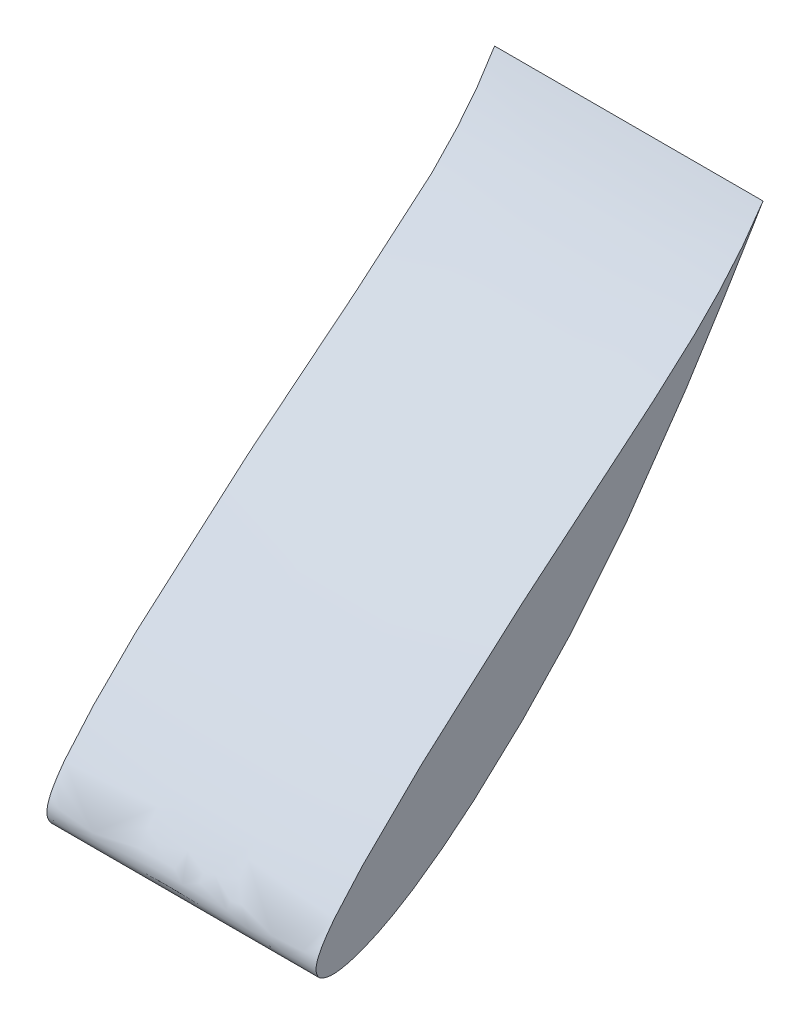
ISO-10303-21;
HEADER;
FILE_DESCRIPTION(('STEP AP214'),'2;1');
FILE_NAME('part.step','',(''),(''),'','','');
FILE_SCHEMA(('AUTOMOTIVE_DESIGN { 1 0 10303 214 1 1 1 1 }'));
ENDSEC;
DATA;
#1=APPLICATION_CONTEXT('core data for automotive mechanical design processes');
#2=APPLICATION_PROTOCOL_DEFINITION('international standard','automotive_design',2000,#1);
#3=PRODUCT_CONTEXT('',#1,'mechanical');
#4=PRODUCT('Part','Part','',(#3));
#5=PRODUCT_RELATED_PRODUCT_CATEGORY('part','',(#4));
#6=PRODUCT_DEFINITION_FORMATION('','',#4);
#7=PRODUCT_DEFINITION_CONTEXT('part definition',#1,'design');
#8=PRODUCT_DEFINITION('design','',#6,#7);
#9=PRODUCT_DEFINITION_SHAPE('','',#8);
#10=(LENGTH_UNIT() NAMED_UNIT(*) SI_UNIT(.MILLI.,.METRE.));
#11=(NAMED_UNIT(*) PLANE_ANGLE_UNIT() SI_UNIT($,.RADIAN.));
#12=(NAMED_UNIT(*) SI_UNIT($,.STERADIAN.) SOLID_ANGLE_UNIT());
#13=UNCERTAINTY_MEASURE_WITH_UNIT(LENGTH_MEASURE(1.E-05),#10,'distance_accuracy_value','');
#14=(GEOMETRIC_REPRESENTATION_CONTEXT(3) GLOBAL_UNCERTAINTY_ASSIGNED_CONTEXT((#13)) GLOBAL_UNIT_ASSIGNED_CONTEXT((#10,
#11,#12)) REPRESENTATION_CONTEXT('',''));
#15=CARTESIAN_POINT('',(0.,0.,0.));
#16=DIRECTION('',(0.,0.,1.));
#17=DIRECTION('',(1.,0.,0.));
#18=AXIS2_PLACEMENT_3D('',#15,#16,#17);
#19=CARTESIAN_POINT('',(457.2,0.,0.));
#20=DIRECTION('',(1.,0.,0.));
#21=DIRECTION('',(0.,0.,-1.));
#22=AXIS2_PLACEMENT_3D('',#19,#20,#21);
#23=PLANE('',#22);
#24=CARTESIAN_POINT('',(457.2,52.9354799084839,-40.4048691135743));
#25=CARTESIAN_POINT('',(457.2,52.4137671791328,-40.1171040912813));
#26=CARTESIAN_POINT('',(457.2,51.8905685831844,-39.8320779606693));
#27=CARTESIAN_POINT('',(457.2,50.8427851251022,-39.2642197298032));
#28=CARTESIAN_POINT('',(457.2,50.3181999086966,-38.9813882816468));
#29=CARTESIAN_POINT('',(457.2,49.2694523012916,-38.4147551131559));
#30=CARTESIAN_POINT('',(457.2,48.7452899840904,-38.1309532558313));
#31=CARTESIAN_POINT('',(457.2,47.6992201579779,-37.5591676312185));
#32=CARTESIAN_POINT('',(457.2,47.1773127322352,-37.2711837113608));
#33=CARTESIAN_POINT('',(457.2,46.1349017641188,-36.6901365499874));
#34=CARTESIAN_POINT('',(457.2,45.6144034418478,-36.397063943887));
#35=CARTESIAN_POINT('',(457.2,44.5761426285644,-35.8061908707365));
#36=CARTESIAN_POINT('',(457.2,44.0583799559348,-35.5083907229367));
#37=CARTESIAN_POINT('',(457.2,43.0257851322636,-34.9078131348833));
#38=CARTESIAN_POINT('',(457.2,42.510952819949,-34.6050359721771));
#39=CARTESIAN_POINT('',(457.2,41.4849956085863,-33.9932456134668));
#40=CARTESIAN_POINT('',(457.2,40.9738707175012,-33.6842324040741));
#41=CARTESIAN_POINT('',(457.2,40.1336696469238,-33.1678314169617));
#42=CARTESIAN_POINT('',(457.2,39.8032749919467,-32.9625890199522));
#43=CARTESIAN_POINT('',(457.2,39.1446917717298,-32.5485956801432));
#44=CARTESIAN_POINT('',(457.2,38.8165032070029,-32.3398447365282));
#45=CARTESIAN_POINT('',(457.2,37.8355279950811,-31.7079754125045));
#46=CARTESIAN_POINT('',(457.2,37.1863386907045,-31.2792447393543));
#47=CARTESIAN_POINT('',(457.2,35.8986992060643,-30.405861784162));
#48=CARTESIAN_POINT('',(457.2,35.2602497323342,-29.961208460602));
#49=CARTESIAN_POINT('',(457.2,33.9951650694657,-29.0549103837809));
#50=CARTESIAN_POINT('',(457.2,33.3685338092642,-28.5932601254226));
#51=CARTESIAN_POINT('',(457.2,32.4392932030813,-27.8867549503951));
#52=CARTESIAN_POINT('',(457.2,32.1313344147112,-27.6489179210354));
#53=CARTESIAN_POINT('',(457.2,31.5192627016711,-27.1683405039597));
#54=CARTESIAN_POINT('',(457.2,31.2151497647286,-26.925600131897));
#55=CARTESIAN_POINT('',(457.2,30.6111562964968,-26.4349992041999));
#56=CARTESIAN_POINT('',(457.2,30.3112751333579,-26.1871394268595));
#57=CARTESIAN_POINT('',(457.2,29.7158628621026,-25.6862547377442));
#58=CARTESIAN_POINT('',(457.2,29.420331739331,-25.4332298433773));
#59=CARTESIAN_POINT('',(457.2,28.6840324472951,-24.7920437085877));
#60=CARTESIAN_POINT('',(457.2,28.246004189344,-24.4007299705181));
#61=CARTESIAN_POINT('',(457.2,27.3795755004373,-23.6074883930266));
#62=CARTESIAN_POINT('',(457.2,26.9511763378778,-23.2055591702679));
#63=CARTESIAN_POINT('',(457.2,26.1038176076999,-22.3916555596177));
#64=CARTESIAN_POINT('',(457.2,25.6848604624223,-21.9796786491964));
#65=CARTESIAN_POINT('',(457.2,24.8570206424311,-21.1454040079464));
#66=CARTESIAN_POINT('',(457.2,24.4481418704601,-20.7231024012673));
#67=CARTESIAN_POINT('',(457.2,23.6421147130416,-19.8690896635006));
#68=CARTESIAN_POINT('',(457.2,23.2449438764881,-19.43739973212));
#69=CARTESIAN_POINT('',(457.2,22.4623198781675,-18.5636361319259));
#70=CARTESIAN_POINT('',(457.2,22.0768648185678,-18.1215641656817));
#71=CARTESIAN_POINT('',(457.2,21.3203157671386,-17.2256213509702));
#72=CARTESIAN_POINT('',(457.2,20.9492145039481,-16.7717566765588));
#73=CARTESIAN_POINT('',(457.2,20.4052688240907,-16.0811189900641));
#74=CARTESIAN_POINT('',(457.2,20.2261029665966,-15.8493096925172));
#75=CARTESIAN_POINT('',(457.2,19.8723136756623,-15.382253605423));
#76=CARTESIAN_POINT('',(457.2,19.6976901325477,-15.1470068990867));
#77=CARTESIAN_POINT('',(457.2,19.3418648654349,-14.6569986272613));
#78=CARTESIAN_POINT('',(457.2,19.1610075414958,-14.4019864838265));
#79=CARTESIAN_POINT('',(457.2,18.805873926172,-13.8874008969019));
#80=CARTESIAN_POINT('',(457.2,18.6315977907803,-13.627827345507));
#81=CARTESIAN_POINT('',(457.2,18.2902390469425,-13.1034038860313));
#82=CARTESIAN_POINT('',(457.2,18.1231681454844,-12.83854634336));
#83=CARTESIAN_POINT('',(457.2,17.7976489134159,-12.3035805580216));
#84=CARTESIAN_POINT('',(457.2,17.6392001124111,-12.0334726028938));
#85=CARTESIAN_POINT('',(457.2,17.3738012548686,-11.5611517336304));
#86=CARTESIAN_POINT('',(457.2,17.2644845001264,-11.3602683645786));
#87=CARTESIAN_POINT('',(457.2,17.0518507431714,-10.9553224036648));
#88=CARTESIAN_POINT('',(457.2,16.9485342237722,-10.7512595576349));
#89=CARTESIAN_POINT('',(457.2,16.7485097381108,-10.3398320265827));
#90=CARTESIAN_POINT('',(457.2,16.6518038877514,-10.1324663103413));
#91=CARTESIAN_POINT('',(457.2,16.4661625519,-9.7152440424853));
#92=CARTESIAN_POINT('',(457.2,16.3771982927722,-9.5054003241108));
#93=CARTESIAN_POINT('',(457.2,16.2073909281223,-9.0824914057902));
#94=CARTESIAN_POINT('',(457.2,16.1265460475586,-8.86942692173089));
#95=CARTESIAN_POINT('',(457.2,15.9749599514939,-8.43980850079228));
#96=CARTESIAN_POINT('',(457.2,15.9042135319009,-8.22325642568962));
#97=CARTESIAN_POINT('',(457.2,15.8034874402061,-7.88325776806801));
#98=CARTESIAN_POINT('',(457.2,15.7693276117838,-7.76104374170039));
#99=CARTESIAN_POINT('',(457.2,15.7052743042024,-7.51550964157994));
#100=CARTESIAN_POINT('',(457.2,15.6753803528027,-7.39218969186383));
#101=CARTESIAN_POINT('',(457.2,15.6202682791386,-7.14379287465528));
#102=CARTESIAN_POINT('',(457.2,15.5950765144787,-7.01871009599406));
#103=CARTESIAN_POINT('',(457.2,15.5613623209077,-6.83035160152533));
#104=CARTESIAN_POINT('',(457.2,15.5508022702041,-6.76743640262986));
#105=CARTESIAN_POINT('',(457.2,15.5311157184808,-6.64137968067121));
#106=CARTESIAN_POINT('',(457.2,15.5219892533447,-6.57823815198328));
#107=CARTESIAN_POINT('',(457.2,15.5050844398142,-6.45080984080302));
#108=CARTESIAN_POINT('',(457.2,15.4973283467258,-6.38652007716671));
#109=CARTESIAN_POINT('',(457.2,15.4835296797135,-6.2577598951192));
#110=CARTESIAN_POINT('',(457.2,15.4774870986419,-6.19328947746269));
#111=CARTESIAN_POINT('',(457.2,15.4625630744186,-5.99955447085834));
#112=CARTESIAN_POINT('',(457.2,15.4568907240827,-5.87000341705987));
#113=CARTESIAN_POINT('',(457.2,15.4575232936983,-5.61190323573918));
#114=CARTESIAN_POINT('',(457.2,15.4637307328678,-5.48335457034874));
#115=CARTESIAN_POINT('',(457.2,15.4915324434705,-5.22796100931924));
#116=CARTESIAN_POINT('',(457.2,15.5130983283915,-5.10111340966897));
#117=CARTESIAN_POINT('',(457.2,15.559829776485,-4.91151294310817));
#118=CARTESIAN_POINT('',(457.2,15.5783515771167,-4.84709518949867));
#119=CARTESIAN_POINT('',(457.2,15.6206103401288,-4.72000381889936));
#120=CARTESIAN_POINT('',(457.2,15.6443451894726,-4.65732950679325));
#121=CARTESIAN_POINT('',(457.2,15.6970921256112,-4.53428250324715));
#122=CARTESIAN_POINT('',(457.2,15.7261013075383,-4.47390856689251));
#123=CARTESIAN_POINT('',(457.2,15.7892667023101,-4.35594521442252));
#124=CARTESIAN_POINT('',(457.2,15.8234201277916,-4.29835431252996));
#125=CARTESIAN_POINT('',(457.2,15.8755215818266,-4.21855545339244));
#126=CARTESIAN_POINT('',(457.2,15.8914983790562,-4.19503976299052));
#127=CARTESIAN_POINT('',(457.2,15.9242717432823,-4.14862809669595));
#128=CARTESIAN_POINT('',(457.2,15.9410673233113,-4.12573142399903));
#129=CARTESIAN_POINT('',(457.2,15.9582662090284,-4.10313794384454));
#130=B_SPLINE_CURVE_WITH_KNOTS('',3,(#24,#25,#26,#27,#28,#29,#30,#31,#32,#33,#34,#35,#36,#37,
#38,#39,#40,#41,#42,#43,#44,#45,#46,#47,#48,#49,#50,#51,#52,#53,#54,#55,#56,#57,#58,#59,#60,#61,
#62,#63,#64,#65,#66,#67,#68,#69,#70,#71,#72,#73,#74,#75,#76,#77,#78,#79,#80,#81,#82,#83,#84,#85,
#86,#87,#88,#89,#90,#91,#92,#93,#94,#95,#96,#97,#98,#99,#100,#101,#102,#103,#104,#105,#106,#107,
#108,#109,#110,#111,#112,#113,#114,#115,#116,#117,#118,#119,#120,#121,#122,#123,#124,#125,#126,
#127,#128,#129),.UNSPECIFIED.,.F.,.F.,(4,2,2,2,2,2,2,2,2,2,2,2,2,2,2,2,2,2,2,2,2,2,2,2,2,2,2,2,
2,2,2,2,2,2,2,2,2,2,2,2,2,2,2,2,2,2,2,2,2,2,2,2,4),(0.,1.78740243978368,3.57531705559406,
5.3634954459217,7.15173923715415,8.94372357062987,10.7355874021623,12.5273516456386,
14.3191197363851,15.4859609607554,16.6528024563576,18.9865095751298,21.3203696240755,
23.6549923486229,24.8222751687598,25.9895542630703,27.1566571855475,28.3237561752133,
30.0856506710399,31.8477759088114,33.6103481872038,35.3735926081428,37.1332009491421,
38.8925227163342,40.6509412493647,41.529828484562,42.4086944792673,43.3465099154056,
44.2843475665187,45.22365563294,46.1629124022081,46.8489276883576,47.5349980989976,
48.2212870845191,48.90490540069,49.5883739388381,50.2714889800971,50.6521213426087,
51.0327115356626,51.4153749112126,51.6067468013617,51.7981234809145,51.9923684624081,
52.1866126336212,52.5752138252862,52.9606399782295,53.3453556032846,53.5462461702077,
53.7470554587213,53.9477544835986,54.1483451500947,54.2336191558206,54.3187927974776),.UNSPECIFIED.);
#131=CARTESIAN_POINT('',(457.2,52.9354799084839,-40.4048691135743));
#132=VERTEX_POINT('',#131);
#133=CARTESIAN_POINT('',(457.2,15.9582662090284,-4.10313794384454));
#134=VERTEX_POINT('',#133);
#135=EDGE_CURVE('E38',#132,#134,#130,.T.);
#136=ORIENTED_EDGE('',*,*,#135,.T.);
#137=CARTESIAN_POINT('',(457.2,15.9582662090284,-4.10313794384454));
#138=CARTESIAN_POINT('',(457.2,15.9897020153264,-4.07603525395711));
#139=CARTESIAN_POINT('',(457.2,16.022089848652,-4.05000458233444));
#140=CARTESIAN_POINT('',(457.2,16.0887589659927,-4.00041472982741));
#141=CARTESIAN_POINT('',(457.2,16.1230423692145,-3.9768584041165));
#142=CARTESIAN_POINT('',(457.2,16.1934066459629,-3.93261662088433));
#143=CARTESIAN_POINT('',(457.2,16.2294868306567,-3.91193007451468));
#144=CARTESIAN_POINT('',(457.2,16.3032888141034,-3.87375793683372));
#145=CARTESIAN_POINT('',(457.2,16.3410099427401,-3.85627105377795));
#146=CARTESIAN_POINT('',(457.2,16.4181180860546,-3.82465223698176));
#147=CARTESIAN_POINT('',(457.2,16.4575141941885,-3.81054242117928));
#148=CARTESIAN_POINT('',(457.2,16.5374440963445,-3.78597966585571));
#149=CARTESIAN_POINT('',(457.2,16.5779782608603,-3.77552793248902));
#150=CARTESIAN_POINT('',(457.2,16.6597137211283,-3.75833661457222));
#151=CARTESIAN_POINT('',(457.2,16.7009130200006,-3.75158749775363));
#152=CARTESIAN_POINT('',(457.2,16.7837553225183,-3.74164969487144));
#153=CARTESIAN_POINT('',(457.2,16.8253985706162,-3.73846308481202));
#154=CARTESIAN_POINT('',(457.2,16.9196325297581,-3.7350510513076));
#155=CARTESIAN_POINT('',(457.2,16.9722589612038,-3.73580902337417));
#156=CARTESIAN_POINT('',(457.2,17.077234931292,-3.74205961557324));
#157=CARTESIAN_POINT('',(457.2,17.1295843040023,-3.74755480728034));
#158=CARTESIAN_POINT('',(457.2,17.2338893525741,-3.76264945874354));
#159=CARTESIAN_POINT('',(457.2,17.2858425742994,-3.77226545563119));
#160=CARTESIAN_POINT('',(457.2,17.3889761189339,-3.79495397219648));
#161=CARTESIAN_POINT('',(457.2,17.4401564231437,-3.8080265753596));
#162=CARTESIAN_POINT('',(457.2,17.6280926365988,-3.86167627107391));
#163=CARTESIAN_POINT('',(457.2,17.7622569331989,-3.91120068965462));
#164=CARTESIAN_POINT('',(457.2,18.0258898005159,-4.02150722358911));
#165=CARTESIAN_POINT('',(457.2,18.1553477224089,-4.08231317332603));
#166=CARTESIAN_POINT('',(457.2,18.4104908166563,-4.21314295466955));
#167=CARTESIAN_POINT('',(457.2,18.5361494670463,-4.28321866374379));
#168=CARTESIAN_POINT('',(457.2,18.7216179623973,-4.39314814950793));
#169=CARTESIAN_POINT('',(457.2,18.7829048965487,-4.43057221251719));
#170=CARTESIAN_POINT('',(457.2,18.9046446755973,-4.50676059389833));
#171=CARTESIAN_POINT('',(457.2,18.965097501129,-4.54552494331469));
#172=CARTESIAN_POINT('',(457.2,19.0915533446006,-4.62815368485821));
#173=CARTESIAN_POINT('',(457.2,19.1574826365934,-4.67213043221843));
#174=CARTESIAN_POINT('',(457.2,19.2885983606809,-4.76117890936007));
#175=CARTESIAN_POINT('',(457.2,19.353784779809,-4.80625065821139));
#176=CARTESIAN_POINT('',(457.2,19.5482524380144,-4.94303182885161));
#177=CARTESIAN_POINT('',(457.2,19.6764375859473,-5.03630422612702));
#178=CARTESIAN_POINT('',(457.2,19.9302829474707,-5.22657897441082));
#179=CARTESIAN_POINT('',(457.2,20.0559393060194,-5.32358644726365));
#180=CARTESIAN_POINT('',(457.2,20.3048060327687,-5.5206764791757));
#181=CARTESIAN_POINT('',(457.2,20.4280164576332,-5.62075896686017));
#182=CARTESIAN_POINT('',(457.2,20.6726718998019,-5.82350094371518));
#183=CARTESIAN_POINT('',(457.2,20.7941132648992,-5.92616482249761));
#184=CARTESIAN_POINT('',(457.2,21.0355349737486,-6.13319472360558));
#185=CARTESIAN_POINT('',(457.2,21.1555152926405,-6.23756077482368));
#186=CARTESIAN_POINT('',(457.2,21.3944207651361,-6.44755720229343));
#187=CARTESIAN_POINT('',(457.2,21.513345624505,-6.55318791294483));
#188=CARTESIAN_POINT('',(457.2,21.7501165953293,-6.76564712416944));
#189=CARTESIAN_POINT('',(457.2,21.8679627238733,-6.87247560570848));
#190=CARTESIAN_POINT('',(457.2,22.2200410424747,-7.19464217324689));
#191=CARTESIAN_POINT('',(457.2,22.4527708435656,-7.411624082476));
#192=CARTESIAN_POINT('',(457.2,22.9144409520659,-7.84894306038991));
#193=CARTESIAN_POINT('',(457.2,23.1433860228656,-8.06927511447871));
#194=CARTESIAN_POINT('',(457.2,23.598141389388,-8.51281311509279));
#195=CARTESIAN_POINT('',(457.2,23.8239538805279,-8.73601681307738));
#196=CARTESIAN_POINT('',(457.2,24.2729612176462,-9.18494952177604));
#197=CARTESIAN_POINT('',(457.2,24.4961565726104,-9.41067802419823));
#198=CARTESIAN_POINT('',(457.2,24.9383265151357,-9.86201631925961));
#199=CARTESIAN_POINT('',(457.2,25.1573210542338,-10.0876065843658));
#200=CARTESIAN_POINT('',(457.2,25.593396569749,-10.5406298049501));
#201=CARTESIAN_POINT('',(457.2,25.81047753781,-10.7680627684664));
#202=CARTESIAN_POINT('',(457.2,26.4589161881648,-11.4530302659166));
#203=CARTESIAN_POINT('',(457.2,26.8874649213002,-11.9132286072324));
#204=CARTESIAN_POINT('',(457.2,27.7377942848645,-12.8403556723915));
#205=CARTESIAN_POINT('',(457.2,28.1595705214955,-13.3072884198676));
#206=CARTESIAN_POINT('',(457.2,28.9966659869544,-14.2468967008062));
#207=CARTESIAN_POINT('',(457.2,29.4119852369521,-14.7195722154315));
#208=CARTESIAN_POINT('',(457.2,30.0309625174289,-15.431320386039));
#209=CARTESIAN_POINT('',(457.2,30.2364419650461,-15.6688150311787));
#210=CARTESIAN_POINT('',(457.2,30.646386774487,-16.144678390807));
#211=CARTESIAN_POINT('',(457.2,30.8508521362456,-16.3830471053516));
#212=CARTESIAN_POINT('',(457.2,31.2589627460274,-16.8604866948287));
#213=CARTESIAN_POINT('',(457.2,31.46260799043,-17.0995575728529));
#214=CARTESIAN_POINT('',(457.2,31.8693010108735,-17.5782068511626));
#215=CARTESIAN_POINT('',(457.2,32.07234878687,-17.8177852514857));
#216=CARTESIAN_POINT('',(457.2,32.4778429404615,-18.2973939205829));
#217=CARTESIAN_POINT('',(457.2,32.6802893970942,-18.5374241225207));
#218=CARTESIAN_POINT('',(457.2,33.0845611164306,-19.0180068167914));
#219=CARTESIAN_POINT('',(457.2,33.2863863793655,-19.2585593089299));
#220=CARTESIAN_POINT('',(457.2,33.8908879340148,-19.9810259659593));
#221=CARTESIAN_POINT('',(457.2,34.2925934504756,-20.4637534004702));
#222=CARTESIAN_POINT('',(457.2,35.0466649777267,-21.3754641189446));
#223=CARTESIAN_POINT('',(457.2,35.399348207576,-21.8041850626722));
#224=CARTESIAN_POINT('',(457.2,36.1024314375798,-22.6635053588918));
#225=CARTESIAN_POINT('',(457.2,36.4528314042357,-23.094104738789));
#226=CARTESIAN_POINT('',(457.2,37.1514521900062,-23.9570055350307));
#227=CARTESIAN_POINT('',(457.2,37.4996731957723,-24.3893068002756));
#228=CARTESIAN_POINT('',(457.2,38.0204454971774,-25.0389392955962));
#229=CARTESIAN_POINT('',(457.2,38.1937598105267,-25.2556593367713));
#230=CARTESIAN_POINT('',(457.2,38.5398849019148,-25.6895011778673));
#231=CARTESIAN_POINT('',(457.2,38.7126956799499,-25.9066229777912));
#232=CARTESIAN_POINT('',(457.2,39.2299570390506,-26.5576280966376));
#233=CARTESIAN_POINT('',(457.2,39.5738677075427,-26.991939965786));
#234=CARTESIAN_POINT('',(457.2,40.2615370428967,-27.8607104619387));
#235=CARTESIAN_POINT('',(457.2,40.6052957035076,-28.2951690938787));
#236=CARTESIAN_POINT('',(457.2,41.121839589148,-28.9462702074219));
#237=CARTESIAN_POINT('',(457.2,41.2942039019865,-29.163246272597));
#238=CARTESIAN_POINT('',(457.2,41.6393460537935,-29.5968699893257));
#239=CARTESIAN_POINT('',(457.2,41.8121238935019,-29.8135176402905));
#240=CARTESIAN_POINT('',(457.2,42.1585338804847,-30.2463932599515));
#241=CARTESIAN_POINT('',(457.2,42.3321665658674,-30.462620798786));
#242=CARTESIAN_POINT('',(457.2,42.6806089210365,-30.8941246088143));
#243=CARTESIAN_POINT('',(457.2,42.8554185868268,-31.1094008832336));
#244=CARTESIAN_POINT('',(457.2,43.3148503209863,-31.6709171206012));
#245=CARTESIAN_POINT('',(457.2,43.6007580307856,-32.0161094894351));
#246=CARTESIAN_POINT('',(457.2,44.1784642731912,-32.7015366365121));
#247=CARTESIAN_POINT('',(457.2,44.4702627076355,-33.0417714972039));
#248=CARTESIAN_POINT('',(457.2,45.0612003142559,-33.7153877683856));
#249=CARTESIAN_POINT('',(457.2,45.3603339625642,-34.0487740084638));
#250=CARTESIAN_POINT('',(457.2,45.9672075562747,-34.7069595453539));
#251=CARTESIAN_POINT('',(457.2,46.2749375647991,-35.0317679758781));
#252=CARTESIAN_POINT('',(457.2,46.9002216530696,-35.6711102804375));
#253=CARTESIAN_POINT('',(457.2,47.2177644098699,-35.9856551945514));
#254=CARTESIAN_POINT('',(457.2,47.8672026079939,-36.6059138507442));
#255=CARTESIAN_POINT('',(457.2,48.1992058656944,-36.9115150879168));
#256=CARTESIAN_POINT('',(457.2,48.8758135788749,-37.5087170241876));
#257=CARTESIAN_POINT('',(457.2,49.2204222933768,-37.8003129128558));
#258=CARTESIAN_POINT('',(457.2,49.9233411173012,-38.3680020383429));
#259=CARTESIAN_POINT('',(457.2,50.2816770487059,-38.6440633770164));
#260=CARTESIAN_POINT('',(457.2,51.0132676702576,-39.1790900724475));
#261=CARTESIAN_POINT('',(457.2,51.3865788373319,-39.437978529325));
#262=CARTESIAN_POINT('',(457.2,52.1494061517508,-39.9368521995779));
#263=CARTESIAN_POINT('',(457.2,52.5390187454854,-40.1766897148497));
#264=CARTESIAN_POINT('',(457.2,52.9354799084839,-40.4048691135743));
#265=B_SPLINE_CURVE_WITH_KNOTS('',3,(#137,#138,#139,#140,#141,#142,#143,#144,#145,#146,#147,
#148,#149,#150,#151,#152,#153,#154,#155,#156,#157,#158,#159,#160,#161,#162,#163,#164,#165,#166,
#167,#168,#169,#170,#171,#172,#173,#174,#175,#176,#177,#178,#179,#180,#181,#182,#183,#184,#185,
#186,#187,#188,#189,#190,#191,#192,#193,#194,#195,#196,#197,#198,#199,#200,#201,#202,#203,#204,
#205,#206,#207,#208,#209,#210,#211,#212,#213,#214,#215,#216,#217,#218,#219,#220,#221,#222,#223,
#224,#225,#226,#227,#228,#229,#230,#231,#232,#233,#234,#235,#236,#237,#238,#239,#240,#241,#242,
#243,#244,#245,#246,#247,#248,#249,#250,#251,#252,#253,#254,#255,#256,#257,#258,#259,#260,#261,
#262,#263,#264),.UNSPECIFIED.,.F.,.F.,(4,2,2,2,2,2,2,2,2,2,2,2,2,2,2,2,2,2,2,2,2,2,2,2,2,2,2,2,
2,2,2,2,2,2,2,2,2,2,2,2,2,2,2,2,2,2,2,2,2,2,2,2,2,2,2,2,2,2,2,2,2,2,2,4),(0.,0.124525638798653,
0.24919342598726,0.373813781735265,0.498383715129927,0.623748459296347,0.749154500263772,
0.874236153909776,0.999390659319536,1.15703307612544,1.31476112220819,1.47312816039159,
1.63149902387587,2.05938490252536,2.48818528376442,2.91949585061344,3.13491594575792,
3.35034103393528,3.58808070570055,3.82582452076969,4.30132826282289,4.77750905712526,
5.25367880704273,5.7307218574973,6.20777301369014,6.68495322656922,7.16212586713364,
8.11664035824057,9.06984456110098,10.022343033479,10.9746530826304,11.9178517316772,
12.8610544973438,14.7474801689798,16.6350839092462,18.5226814595321,19.4648206317325,
20.406959864348,21.3491032516883,22.2912467090843,23.2332603035001,24.1752735473018,
26.0592839678715,27.7247142098297,29.3901688311694,31.0554787798608,31.887973712939,
32.7204686520022,34.3824279664769,36.0444502325879,36.8757696259224,37.7070905078335,
38.5390273087381,39.3709612864979,40.715573182685,42.060162690964,43.4037689818192,
44.7458816486083,46.0864995800645,47.4398733924925,48.7937087731043,50.1502296014225,
51.5124636774795,52.8843958238448),.UNSPECIFIED.);
#266=EDGE_CURVE('E11',#134,#132,#265,.T.);
#267=ORIENTED_EDGE('',*,*,#266,.T.);
#268=EDGE_LOOP('',(#136,#267));
#269=FACE_BOUND('',#268,.T.);
#270=ADVANCED_FACE('F34',(#269),#23,.F.);
#271=CARTESIAN_POINT('',(472.296529068861,-118.449884830258,52.1473222208366));
#272=DIRECTION('',(-0.992432509138968,0.0868265938642406,0.086826593864241));
#273=DIRECTION('',(0.0871557427476515,0.,0.996194698091746));
#274=AXIS2_PLACEMENT_3D('',#271,#272,#273);
#275=PLANE('',#274);
#276=CARTESIAN_POINT('',(479.134440987751,15.9582662090284,-4.10313794384454));
#277=CARTESIAN_POINT('',(479.125834583347,15.9157184529533,-4.15896184025432));
#278=CARTESIAN_POINT('',(479.117278779834,15.8756764895492,-4.21671315849034));
#279=CARTESIAN_POINT('',(479.100346091409,15.8009933525406,-4.33557153581211));
#280=CARTESIAN_POINT('',(479.091969079133,15.7663482155778,-4.39667608730388));
#281=CARTESIAN_POINT('',(479.075619407128,15.7034024976282,-4.520607975498));
#282=CARTESIAN_POINT('',(479.067642051158,15.6749915812691,-4.58337865511644));
#283=CARTESIAN_POINT('',(479.051976446843,15.6237474630873,-4.71119321361102));
#284=CARTESIAN_POINT('',(479.044288248479,15.6009152218229,-4.7762374817618));
#285=CARTESIAN_POINT('',(479.027495316699,15.5560444443775,-4.92331079288327));
#286=CARTESIAN_POINT('',(479.018475527332,15.5354177554752,-5.0057807682045));
#287=CARTESIAN_POINT('',(479.000967552528,15.5018256990572,-5.17230577951144));
#288=CARTESIAN_POINT('',(478.992479495909,15.4888621816708,-5.25636119322107));
#289=CARTESIAN_POINT('',(478.975963530884,15.4696264967111,-5.42590385232585));
#290=CARTESIAN_POINT('',(478.967939594376,15.4634057509095,-5.5113971204854));
#291=CARTESIAN_POINT('',(478.952379637046,15.4567992127399,-5.68264170842998));
#292=CARTESIAN_POINT('',(478.94484369043,15.4564143057276,-5.76839306539599));
#293=CARTESIAN_POINT('',(478.930983717752,15.4602245126824,-5.93062348496922));
#294=CARTESIAN_POINT('',(478.924616319241,15.4639337022134,-6.00711237251844));
#295=CARTESIAN_POINT('',(478.912172056713,15.4744885185482,-6.15990576041205));
#296=CARTESIAN_POINT('',(478.90609525833,15.4813348502276,-6.23621021544138));
#297=CARTESIAN_POINT('',(478.894165658247,15.4974570753671,-6.38868839348404));
#298=CARTESIAN_POINT('',(478.888313200721,15.5067365431003,-6.46486175683556));
#299=CARTESIAN_POINT('',(478.876818285146,15.5274134368291,-6.61692613680618));
#300=CARTESIAN_POINT('',(478.87117580655,15.5388106549485,-6.69281718039235));
#301=CARTESIAN_POINT('',(478.854552329142,15.5760801459156,-6.92009388758571));
#302=CARTESIAN_POINT('',(478.843881227227,15.6050219435825,-7.07100693826773));
#303=CARTESIAN_POINT('',(478.823257788505,15.6702267768445,-7.3719387547842));
#304=CARTESIAN_POINT('',(478.813308691563,15.7065203382005,-7.52195101456247));
#305=CARTESIAN_POINT('',(478.794107454852,15.7853058597975,-7.82020767603878));
#306=CARTESIAN_POINT('',(478.784854593479,15.827791264566,-7.96845377025231));
#307=CARTESIAN_POINT('',(478.771435983889,15.8955463201378,-8.18958423527005));
#308=CARTESIAN_POINT('',(478.767040287042,15.9188001152871,-8.26308107528047));
#309=CARTESIAN_POINT('',(478.758395743378,15.9665822534322,-8.40967079963716));
#310=CARTESIAN_POINT('',(478.754146900951,15.9911106344722,-8.48276367185357));
#311=CARTESIAN_POINT('',(478.741348662321,16.0680578491956,-8.70599542349595));
#312=CARTESIAN_POINT('',(478.73302650483,16.1224198804969,-8.85548015019394));
#313=CARTESIAN_POINT('',(478.716906098049,16.2355086376239,-9.15282599997181));
#314=CARTESIAN_POINT('',(478.709107908008,16.2942358554837,-9.30068693785931));
#315=CARTESIAN_POINT('',(478.693981264598,16.4155533632251,-9.594902770942));
#316=CARTESIAN_POINT('',(478.686652986175,16.4781450750132,-9.74125708840135));
#317=CARTESIAN_POINT('',(478.672452609175,16.606950189895,-10.0323732551102));
#318=CARTESIAN_POINT('',(478.665580491153,16.6731634383861,-10.1771351720226));
#319=CARTESIAN_POINT('',(478.645586187994,16.8770553129029,-10.6095629774092));
#320=CARTESIAN_POINT('',(478.633110665079,17.019785757315,-10.8948893012425));
#321=CARTESIAN_POINT('',(478.609716686176,17.3168834149869,-11.4593813613387));
#322=CARTESIAN_POINT('',(478.598797979416,17.4712487479552,-11.7385480836561));
#323=CARTESIAN_POINT('',(478.578334889096,17.7901741761059,-12.291367704443));
#324=CARTESIAN_POINT('',(478.568791763709,17.9547434100051,-12.565015360646));
#325=CARTESIAN_POINT('',(478.550911814473,18.2924013916283,-13.1070420972005));
#326=CARTESIAN_POINT('',(478.542575045063,18.4654905233483,-13.37542093932));
#327=CARTESIAN_POINT('',(478.5269961498,18.8190265695107,-13.9070245731602));
#328=CARTESIAN_POINT('',(478.51975322081,18.9994679608301,-14.1702530216539));
#329=CARTESIAN_POINT('',(478.506234961773,19.3668477446254,-14.6921472132845));
#330=CARTESIAN_POINT('',(478.49995962969,19.5537861234318,-14.9508129660197));
#331=CARTESIAN_POINT('',(478.485979084101,20.0074966276736,-15.5643218375597));
#332=CARTESIAN_POINT('',(478.478674142081,20.2769048782262,-15.917225957476));
#333=CARTESIAN_POINT('',(478.465581710258,20.8254498342717,-16.6154180940286));
#334=CARTESIAN_POINT('',(478.459794271805,21.1045868686065,-16.9607058525794));
#335=CARTESIAN_POINT('',(478.44958151283,21.6716791142859,-17.6445304674945));
#336=CARTESIAN_POINT('',(478.445157505852,21.9596425373067,-17.9830605216611));
#337=CARTESIAN_POINT('',(478.437524023258,22.5429935756088,-18.6536626652709));
#338=CARTESIAN_POINT('',(478.434314546976,22.8383811868228,-18.9857347582518));
#339=CARTESIAN_POINT('',(478.42897790699,23.4359304542273,-19.6442820998183));
#340=CARTESIAN_POINT('',(478.426851730382,23.7380980275188,-19.9707519829406));
#341=CARTESIAN_POINT('',(478.423665260863,24.348699914168,-20.6177753828511));
#342=CARTESIAN_POINT('',(478.422604957895,24.6571341683699,-20.9383289554329));
#343=CARTESIAN_POINT('',(478.421516942081,25.2799731085027,-21.5736039732332));
#344=CARTESIAN_POINT('',(478.421489261156,25.5943779787079,-21.8883252378517));
#345=CARTESIAN_POINT('',(478.422430307704,26.2288278200935,-22.5120188679784));
#346=CARTESIAN_POINT('',(478.423399043044,26.5488728357889,-22.8209911880733));
#347=CARTESIAN_POINT('',(478.427796345246,27.520576085122,-23.7424330432411));
#348=CARTESIAN_POINT('',(478.432721283331,28.1805928272351,-24.3461574854603));
#349=CARTESIAN_POINT('',(478.443283254344,29.1872680446597,-25.2321088217803));
#350=CARTESIAN_POINT('',(478.447330648261,29.5254564536761,-25.524035306638));
#351=CARTESIAN_POINT('',(478.454215793927,30.0369986147154,-25.9568798925994));
#352=CARTESIAN_POINT('',(478.456646528062,30.2082231904615,-26.1003210500535));
#353=CARTESIAN_POINT('',(478.461783875231,30.5520995844941,-26.3854772972482));
#354=CARTESIAN_POINT('',(478.464490489074,30.7247514069621,-26.5271923819288));
#355=CARTESIAN_POINT('',(478.473009808383,31.244600058622,-26.9496647682981));
#356=CARTESIAN_POINT('',(478.479224210033,31.593854288929,-27.2278880627108));
#357=CARTESIAN_POINT('',(478.492654176693,32.2973705598687,-27.777899112309));
#358=CARTESIAN_POINT('',(478.499869749924,32.6516326416049,-28.0496868146234));
#359=CARTESIAN_POINT('',(478.515232169233,33.3646283719381,-28.5870892887529));
#360=CARTESIAN_POINT('',(478.523378749092,33.7233607162626,-28.852705799195));
#361=CARTESIAN_POINT('',(478.540532985662,34.4449551653434,-29.3782264270712));
#362=CARTESIAN_POINT('',(478.549540640394,34.8078172606125,-29.6381305576242));
#363=CARTESIAN_POINT('',(478.57724038964,35.8811650957884,-30.3948688101503));
#364=CARTESIAN_POINT('',(478.597058903075,36.5969714562639,-30.8841485255019));
#365=CARTESIAN_POINT('',(478.628889844299,37.6802887147623,-31.6036364609638));
#366=CARTESIAN_POINT('',(478.639852483846,38.0430507382381,-31.841094941044));
#367=CARTESIAN_POINT('',(478.662448860957,38.7715724533899,-32.3113388839567));
#368=CARTESIAN_POINT('',(478.674082598076,39.1373321430734,-32.544124349895));
#369=CARTESIAN_POINT('',(478.709921973374,40.2390319078945,-33.2361781805667));
#370=CARTESIAN_POINT('',(478.73505560045,40.9790489500035,-33.6889165506377));
#371=CARTESIAN_POINT('',(478.774187535885,42.0952772545153,-34.3578647864204));
#372=CARTESIAN_POINT('',(478.787473082627,42.4684673879611,-34.5792004257264));
#373=CARTESIAN_POINT('',(478.814446931088,43.2165437564347,-35.018964295494));
#374=CARTESIAN_POINT('',(478.828135232954,43.5914299920911,-35.2373925248778));
#375=CARTESIAN_POINT('',(478.869317963368,44.7070458550792,-35.8822876252663));
#376=CARTESIAN_POINT('',(478.897324973795,45.4499120423459,-36.3050322185053));
#377=CARTESIAN_POINT('',(478.940289427323,46.5679893946653,-36.9320236198458));
#378=CARTESIAN_POINT('',(478.954767345806,46.9412474131226,-37.1397982728055));
#379=CARTESIAN_POINT('',(478.976710727572,47.5020503627743,-37.4497872211659));
#380=CARTESIAN_POINT('',(478.984062937936,47.6891373104065,-37.5528380198002));
#381=CARTESIAN_POINT('',(478.998842810494,48.0636149160175,-37.7583809090449));
#382=CARTESIAN_POINT('',(479.006270472704,48.2510055740594,-37.8608729995393));
#383=CARTESIAN_POINT('',(479.028637495381,48.8132244477958,-38.1674356342212));
#384=CARTESIAN_POINT('',(479.043674363078,49.1884432344757,-38.370782236654));
#385=CARTESIAN_POINT('',(479.073843982441,49.9392624618562,-38.7767611367617));
#386=CARTESIAN_POINT('',(479.088976734308,50.3148629033544,-38.9793934329395));
#387=CARTESIAN_POINT('',(479.119155676009,51.0651983263515,-39.3847819738443));
#388=CARTESIAN_POINT('',(479.134201967642,51.439933711544,-39.5875374587084));
#389=CARTESIAN_POINT('',(479.164074632517,52.1885257863565,-39.9946834115807));
#390=CARTESIAN_POINT('',(479.17890100445,52.5623824707379,-40.1990738893047));
#391=CARTESIAN_POINT('',(479.193538051512,52.9354799084839,-40.4048691135743));
#392=B_SPLINE_CURVE_WITH_KNOTS('',3,(#276,#277,#278,#279,#280,#281,#282,#283,#284,#285,#286,
#287,#288,#289,#290,#291,#292,#293,#294,#295,#296,#297,#298,#299,#300,#301,#302,#303,#304,#305,
#306,#307,#308,#309,#310,#311,#312,#313,#314,#315,#316,#317,#318,#319,#320,#321,#322,#323,#324,
#325,#326,#327,#328,#329,#330,#331,#332,#333,#334,#335,#336,#337,#338,#339,#340,#341,#342,#343,
#344,#345,#346,#347,#348,#349,#350,#351,#352,#353,#354,#355,#356,#357,#358,#359,#360,#361,#362,
#363,#364,#365,#366,#367,#368,#369,#370,#371,#372,#373,#374,#375,#376,#377,#378,#379,#380,#381,
#382,#383,#384,#385,#386,#387,#388,#389,#390,#391),.UNSPECIFIED.,.F.,.F.,(4,2,2,2,2,2,2,2,2,2,2,
2,2,2,2,2,2,2,2,2,2,2,2,2,2,2,2,2,2,2,2,2,2,2,2,2,2,2,2,2,2,2,2,2,2,2,2,2,2,2,2,2,2,2,2,2,2,4),
(0.,0.212089405865886,0.424022314201156,0.631831426577226,0.83967629516916,1.09571899569715,
1.35182348772321,1.60986763448109,1.86795092874889,2.09840387522465,2.32890862693244,
2.55975390550768,2.79057653650864,3.25245209572038,3.71628626945111,4.17963288949153,
4.41126254004697,4.64289910832646,5.12065111390624,5.59845705253862,6.0764398556416,
6.55440226967295,7.5118920572812,8.46922743726459,9.42743296046804,10.385681710091,
11.3432234222488,12.3007631198567,13.6326942516144,14.9646704476352,16.2979259003222,
17.6311806226213,18.9656480360806,20.3001028583967,21.63459893385,22.9691055465489,
25.6518575359824,26.9921121743314,27.6622441128551,28.3323780154257,29.6720007316916,
31.0116344497079,32.3508860565333,33.6901345873686,36.2915531777342,37.5926517919957,
38.8937495414851,41.4971815385119,42.7994530535477,44.101725051354,46.6672047453864,
47.9495063869655,48.5906570533735,49.2318078529352,50.5129311316227,51.7940570938307,
53.0730632548706,54.3520770218922),.UNSPECIFIED.);
#393=CARTESIAN_POINT('',(479.134440987751,15.9582662090284,-4.10313794384454));
#394=VERTEX_POINT('',#393);
#395=CARTESIAN_POINT('',(479.193538051512,52.9354799084839,-40.4048691135743));
#396=VERTEX_POINT('',#395);
#397=EDGE_CURVE('E70',#394,#396,#392,.T.);
#398=ORIENTED_EDGE('',*,*,#397,.T.);
#399=CARTESIAN_POINT('',(479.193538051512,52.9354799084839,-40.4048691135743));
#400=CARTESIAN_POINT('',(479.17723639022,52.4965110166077,-40.1522290628916));
#401=CARTESIAN_POINT('',(479.162919436943,52.0659220439671,-39.8852836150241));
#402=CARTESIAN_POINT('',(479.138009101069,51.2226180065412,-39.326706019521));
#403=CARTESIAN_POINT('',(479.127405631052,50.8098572326219,-39.0351434624776));
#404=CARTESIAN_POINT('',(479.109596932008,50.0012244228212,-38.4300650141981));
#405=CARTESIAN_POINT('',(479.102389155866,49.6053399314141,-38.1165657810753));
#406=CARTESIAN_POINT('',(479.093932754597,49.0260975887365,-37.6339805471986));
#407=CARTESIAN_POINT('',(479.09151483359,48.836644153369,-37.4721640754026));
#408=CARTESIAN_POINT('',(479.087396360379,48.4615574765013,-37.1441517627444));
#409=CARTESIAN_POINT('',(479.085695808992,48.2759242393507,-36.9779559168965));
#410=CARTESIAN_POINT('',(479.081601549677,47.7243251993175,-36.4731544749797));
#411=CARTESIAN_POINT('',(479.08021814121,47.3638649441442,-36.1285066509288));
#412=CARTESIAN_POINT('',(479.079780575051,46.6561999759808,-35.4258430868534));
#413=CARTESIAN_POINT('',(479.080726749172,46.3089971584703,-35.0678254496492));
#414=CARTESIAN_POINT('',(479.084821328924,45.5847303396683,-34.2967573701348));
#415=CARTESIAN_POINT('',(479.088223335355,45.2091636256252,-33.8823055446409));
#416=CARTESIAN_POINT('',(479.096991837155,44.4700798574922,-33.0429973423235));
#417=CARTESIAN_POINT('',(479.102358009672,44.1065608338245,-32.6181426861178));
#418=CARTESIAN_POINT('',(479.114494497242,43.3882597992938,-31.7611209638884));
#419=CARTESIAN_POINT('',(479.121264906278,43.0334783749988,-31.3289534102068));
#420=CARTESIAN_POINT('',(479.135674299862,42.3279749700942,-30.4587498829811));
#421=CARTESIAN_POINT('',(479.143316351803,41.9772724299554,-30.0206982894601));
#422=CARTESIAN_POINT('',(479.158902214418,41.2778215666762,-29.1431002013085));
#423=CARTESIAN_POINT('',(479.166846003708,40.929073107053,-28.7035538146163));
#424=CARTESIAN_POINT('',(479.182840573,40.2322624647425,-27.82392440874));
#425=CARTESIAN_POINT('',(479.190891352256,39.8842002772922,-27.383841393315));
#426=CARTESIAN_POINT('',(479.204872643837,39.2754078049769,-26.6152420269646));
#427=CARTESIAN_POINT('',(479.210825211363,39.0148184776277,-26.2866145414543));
#428=CARTESIAN_POINT('',(479.222580496564,38.4926842784268,-25.6301168175721));
#429=CARTESIAN_POINT('',(479.228383214432,38.2311394078055,-25.302246578226));
#430=CARTESIAN_POINT('',(479.2398014991,37.7068585703323,-24.6474541497943));
#431=CARTESIAN_POINT('',(479.245417065128,37.444122598574,-24.320531964623));
#432=CARTESIAN_POINT('',(479.256458974476,36.9174513885234,-23.6676511532006));
#433=CARTESIAN_POINT('',(479.261885317562,36.6535161487496,-23.3416925281406));
#434=CARTESIAN_POINT('',(479.272533439466,36.1246729611872,-22.691140750295));
#435=CARTESIAN_POINT('',(479.27775543092,35.8597663561067,-22.366546509761));
#436=CARTESIAN_POINT('',(479.287990842089,35.3286414661741,-21.7184303348366));
#437=CARTESIAN_POINT('',(479.293004261971,35.0624231823878,-21.394908399575));
#438=CARTESIAN_POINT('',(479.307734059942,34.2618182850921,-20.425941141068));
#439=CARTESIAN_POINT('',(479.317139914668,33.725484687506,-19.7820981320051));
#440=CARTESIAN_POINT('',(479.33070828098,32.9174341838979,-18.818960491788));
#441=CARTESIAN_POINT('',(479.335142331324,32.6474054481644,-18.4982503287105));
#442=CARTESIAN_POINT('',(479.341665485174,32.2415685456533,-18.0178534365152));
#443=CARTESIAN_POINT('',(479.343818550908,32.1061571876601,-17.8578324245736));
#444=CARTESIAN_POINT('',(479.348084755325,31.8350871469928,-17.5379994442826));
#445=CARTESIAN_POINT('',(479.35019789399,31.699428464206,-17.3781874760285));
#446=CARTESIAN_POINT('',(479.35646776491,31.2920184502495,-16.8991125095277));
#447=CARTESIAN_POINT('',(479.360554899273,31.019836425571,-16.5802143253107));
#448=CARTESIAN_POINT('',(479.368463201234,30.4738342238143,-15.9438198185178));
#449=CARTESIAN_POINT('',(479.372284369218,30.2000140491149,-15.6263234939075));
#450=CARTESIAN_POINT('',(479.379584695793,29.6502149487345,-14.9930812789473));
#451=CARTESIAN_POINT('',(479.383063782107,29.3742355800859,-14.6773357717625));
#452=CARTESIAN_POINT('',(479.389598154657,28.8196999566042,-14.0481119282687));
#453=CARTESIAN_POINT('',(479.392653440506,28.5411436994233,-13.7346335940258));
#454=CARTESIAN_POINT('',(479.401080408922,27.7010443670887,-12.7982135719476));
#455=CARTESIAN_POINT('',(479.405713666364,27.1350372077764,-12.179248037748));
#456=CARTESIAN_POINT('',(479.411017990572,26.2762863859008,-11.2598685127428));
#457=CARTESIAN_POINT('',(479.412511865244,25.9884010151209,-10.9549080763221));
#458=CARTESIAN_POINT('',(479.414922603184,25.4092467487319,-10.3481989491951));
#459=CARTESIAN_POINT('',(479.415839453747,25.1179777787707,-10.0464503293464));
#460=CARTESIAN_POINT('',(479.417057948537,24.5319319622274,-9.44647705361694));
#461=CARTESIAN_POINT('',(479.41735970184,24.2371557469096,-9.14825178227002));
#462=CARTESIAN_POINT('',(479.417158637683,23.6430201602751,-8.55641436946192));
#463=CARTESIAN_POINT('',(479.416655850369,23.3436609610951,-8.26280205557334));
#464=CARTESIAN_POINT('',(479.414633584048,22.7305567936992,-7.67281249799656));
#465=CARTESIAN_POINT('',(479.413084781765,22.4166472104854,-7.37660580588846));
#466=CARTESIAN_POINT('',(479.408670327508,21.7815465083298,-6.79196254677314));
#467=CARTESIAN_POINT('',(479.405804398091,21.4603538688186,-6.50352763039668));
#468=CARTESIAN_POINT('',(479.399626635839,20.912101425382,-6.02588733261882));
#469=CARTESIAN_POINT('',(479.396740813379,20.6873168361217,-5.83408784500715));
#470=CARTESIAN_POINT('',(479.391352285144,20.344734900917,-5.55309706936878));
#471=CARTESIAN_POINT('',(479.389380167536,20.2296726064291,-5.46057618229048));
#472=CARTESIAN_POINT('',(479.385005426612,19.9973912417252,-5.27829833515265));
#473=CARTESIAN_POINT('',(479.382602827997,19.8801722955972,-5.1885412168626));
#474=CARTESIAN_POINT('',(479.37810941866,19.6790053332935,-5.03873415829222));
#475=CARTESIAN_POINT('',(479.376142315752,19.5956589154293,-4.97787182955407));
#476=CARTESIAN_POINT('',(479.371952690858,19.4277460572406,-4.85784660303476));
#477=CARTESIAN_POINT('',(479.369730151786,19.3431795356361,-4.79868381926524));
#478=CARTESIAN_POINT('',(479.366188645774,19.2153159473994,-4.71129982997225));
#479=CARTESIAN_POINT('',(479.364972555428,19.1724938790995,-4.68237773793141));
#480=CARTESIAN_POINT('',(479.362470363654,19.0865307632723,-4.62501480495573));
#481=CARTESIAN_POINT('',(479.361184262016,19.0433897147897,-4.59657396546316));
#482=CARTESIAN_POINT('',(479.357204454648,18.9134292119953,-4.5121028690435));
#483=CARTESIAN_POINT('',(479.354388915484,18.8260602920497,-4.4569157089963));
#484=CARTESIAN_POINT('',(479.34826319012,18.647759224713,-4.3486320029634));
#485=CARTESIAN_POINT('',(479.344944621587,18.5567909158995,-4.29559510605362));
#486=CARTESIAN_POINT('',(479.337740034515,18.3725164727724,-4.19366946998592));
#487=CARTESIAN_POINT('',(479.33385380922,18.279209496959,-4.14478225254813));
#488=CARTESIAN_POINT('',(479.325421896485,18.0902632962597,-4.05221325541882));
#489=CARTESIAN_POINT('',(479.320877288481,17.994628098052,-4.00852316439878));
#490=CARTESIAN_POINT('',(479.311033273116,17.8008398787834,-3.92725255561879));
#491=CARTESIAN_POINT('',(479.305734454049,17.7026888685561,-3.88966732446728));
#492=CARTESIAN_POINT('',(479.297114133384,17.5560300613784,-3.84153923335723));
#493=CARTESIAN_POINT('',(479.294230988832,17.5087505543714,-3.82721421938336));
#494=CARTESIAN_POINT('',(479.288177199421,17.4135077155403,-3.80116651015007));
#495=CARTESIAN_POINT('',(479.285006566974,17.3655444133139,-3.78944370261744));
#496=CARTESIAN_POINT('',(479.275011867133,17.2208083408721,-3.75894757211723));
#497=CARTESIAN_POINT('',(479.267693672608,17.1229907498144,-3.74477732723857));
#498=CARTESIAN_POINT('',(479.252754263341,16.9414345349914,-3.73397934171053));
#499=CARTESIAN_POINT('',(479.245351040594,16.8578336267327,-3.73499765665677));
#500=CARTESIAN_POINT('',(479.229436920806,16.6920898839396,-3.75115313539185));
#501=CARTESIAN_POINT('',(479.2209272268,16.609945574345,-3.76627507337108));
#502=CARTESIAN_POINT('',(479.202963951255,16.4496091428604,-3.81125982089349));
#503=CARTESIAN_POINT('',(479.193507364784,16.371430870579,-3.84117082658253));
#504=CARTESIAN_POINT('',(479.174003287014,16.2215791366035,-3.91425172163212));
#505=CARTESIAN_POINT('',(479.163955293303,16.1499113410635,-3.95743301975041));
#506=CARTESIAN_POINT('',(479.150582392149,16.0606771774341,-4.02105181574751));
#507=CARTESIAN_POINT('',(479.147359294067,16.0396318007867,-4.03684661875819));
#508=CARTESIAN_POINT('',(479.140906484848,15.998360890035,-4.06933165487121));
#509=CARTESIAN_POINT('',(479.137676832805,15.9781328272363,-4.08601868384678));
#510=CARTESIAN_POINT('',(479.134440987752,15.9582662090284,-4.10313794384454));
#511=B_SPLINE_CURVE_WITH_KNOTS('',3,(#399,#400,#401,#402,#403,#404,#405,#406,#407,#408,#409,
#410,#411,#412,#413,#414,#415,#416,#417,#418,#419,#420,#421,#422,#423,#424,#425,#426,#427,#428,
#429,#430,#431,#432,#433,#434,#435,#436,#437,#438,#439,#440,#441,#442,#443,#444,#445,#446,#447,
#448,#449,#450,#451,#452,#453,#454,#455,#456,#457,#458,#459,#460,#461,#462,#463,#464,#465,#466,
#467,#468,#469,#470,#471,#472,#473,#474,#475,#476,#477,#478,#479,#480,#481,#482,#483,#484,#485,
#486,#487,#488,#489,#490,#491,#492,#493,#494,#495,#496,#497,#498,#499,#500,#501,#502,#503,#504,
#505,#506,#507,#508,#509,#510),.UNSPECIFIED.,.F.,.F.,(4,2,2,2,2,2,2,2,2,2,2,2,2,2,2,2,2,2,2,2,2,
2,2,2,2,2,2,2,2,2,2,2,2,2,2,2,2,2,2,2,2,2,2,2,2,2,2,2,2,2,2,2,2,2,2,4),(0.,1.51966600899785,
3.03517133442636,4.54953806068313,5.2969739661569,6.04441072259425,7.54008541662877,
9.03597315979328,10.7136092407779,12.3909696921975,14.0684424420522,15.7520119427482,
17.4354623509972,19.1189010339228,20.3772500727447,21.6355974918146,22.8939500989529,
24.1523042611451,25.4093122045751,26.6663191266495,29.1803475345408,30.4381661241581,
31.0670762587385,31.6959866798331,32.9538227396524,34.2116569733989,35.4697564020474,
36.7278569771171,39.2439042525551,40.5020288831356,41.7601812126139,43.0181104154019,
44.275992485741,45.5706869855564,46.8656543292344,47.7520293091178,48.1949721850558,
48.6378896544203,48.947536551402,49.2572041723413,49.4122664989103,49.5673292901007,
49.8774107897878,50.1933841966376,50.5094729773044,50.8250492670784,51.1403807390247,
51.2887688923431,51.4371506421522,51.733285826891,51.9840752679551,52.2345942779539,
52.4859351404457,52.7374926934956,52.8170068693283,52.8962525152061),.UNSPECIFIED.);
#512=EDGE_CURVE('E61',#396,#394,#511,.T.);
#513=ORIENTED_EDGE('',*,*,#512,.T.);
#514=EDGE_LOOP('',(#398,#513));
#515=FACE_BOUND('',#514,.T.);
#516=ADVANCED_FACE('F72',(#515),#275,.F.);
#517=CARTESIAN_POINT('',(534.287503140715,52.9354799084838,-40.4048691135743));
#518=CARTESIAN_POINT('',(356.191668760477,52.9354799084841,-40.4048691135743));
#519=CARTESIAN_POINT('',(178.095834380238,52.9354799084844,-40.4048691135743));
#520=CARTESIAN_POINT('',(0.,52.9354799084847,-40.4048691135743));
#521=CARTESIAN_POINT('',(534.287503140715,51.3594459522331,-39.5355547738197));
#522=CARTESIAN_POINT('',(356.191668760477,51.3594459522342,-39.5355547738204));
#523=CARTESIAN_POINT('',(178.095834380238,51.3594459522354,-39.535554773821));
#524=CARTESIAN_POINT('',(0.,51.3594459522365,-39.5355547738216));
#525=CARTESIAN_POINT('',(534.287503140715,48.1872661509876,-37.8507210268244));
#526=CARTESIAN_POINT('',(356.191668760477,48.1872661509887,-37.8507210268251));
#527=CARTESIAN_POINT('',(178.095834380238,48.1872661509898,-37.8507210268257));
#528=CARTESIAN_POINT('',(0.,48.187266150991,-37.8507210268263));
#529=CARTESIAN_POINT('',(534.287503140715,43.507704020654,-35.2180308481153));
#530=CARTESIAN_POINT('',(356.191668760477,43.507704020655,-35.2180308481158));
#531=CARTESIAN_POINT('',(178.095834380238,43.507704020656,-35.2180308481164));
#532=CARTESIAN_POINT('',(0.,43.5077040206569,-35.2180308481169));
#533=CARTESIAN_POINT('',(534.287503140715,38.9411088417165,-32.4716733063186));
#534=CARTESIAN_POINT('',(356.191668760477,38.9411088417174,-32.4716733063192));
#535=CARTESIAN_POINT('',(178.095834380238,38.9411088417183,-32.4716733063197));
#536=CARTESIAN_POINT('',(0.,38.9411088417191,-32.4716733063202));
#537=CARTESIAN_POINT('',(534.287503140715,34.5606914175127,-29.5246268627233));
#538=CARTESIAN_POINT('',(356.191668760477,34.5606914175135,-29.5246268627239));
#539=CARTESIAN_POINT('',(178.095834380238,34.5606914175143,-29.5246268627245));
#540=CARTESIAN_POINT('',(0.,34.5606914175151,-29.5246268627251));
#541=CARTESIAN_POINT('',(534.287503140715,30.4010587553919,-26.3479727120398));
#542=CARTESIAN_POINT('',(356.191668760477,30.4010587553925,-26.3479727120402));
#543=CARTESIAN_POINT('',(178.095834380238,30.4010587553932,-26.3479727120406));
#544=CARTESIAN_POINT('',(0.,30.4010587553938,-26.347972712041));
#545=CARTESIAN_POINT('',(534.287503140715,26.5235459159334,-22.8775996756577));
#546=CARTESIAN_POINT('',(356.191668760477,26.523545915934,-22.8775996756581));
#547=CARTESIAN_POINT('',(178.095834380238,26.5235459159346,-22.8775996756586));
#548=CARTESIAN_POINT('',(0.,26.5235459159352,-22.877599675659));
#549=CARTESIAN_POINT('',(534.287503140715,22.8995490309342,-19.1528802757245));
#550=CARTESIAN_POINT('',(356.191668760477,22.8995490309347,-19.1528802757248));
#551=CARTESIAN_POINT('',(178.095834380238,22.8995490309352,-19.1528802757252));
#552=CARTESIAN_POINT('',(0.,22.8995490309356,-19.1528802757255));
#553=CARTESIAN_POINT('',(534.287503140715,20.1174790147798,-15.8072554136178));
#554=CARTESIAN_POINT('',(356.191668760477,20.1174790147802,-15.8072554136181));
#555=CARTESIAN_POINT('',(178.095834380238,20.1174790147806,-15.8072554136184));
#556=CARTESIAN_POINT('',(0.,20.117479014781,-15.8072554136186));
#557=CARTESIAN_POINT('',(534.287503140715,18.1246178310168,-12.9102526792716));
#558=CARTESIAN_POINT('',(356.191668760477,18.1246178310172,-12.9102526792718));
#559=CARTESIAN_POINT('',(178.095834380238,18.1246178310176,-12.910252679272));
#560=CARTESIAN_POINT('',(0.,18.1246178310181,-12.9102526792722));
#561=CARTESIAN_POINT('',(534.287503140715,17.0161487626907,-10.9570930595945));
#562=CARTESIAN_POINT('',(356.191668760477,17.016148762691,-10.9570930595947));
#563=CARTESIAN_POINT('',(178.095834380238,17.0161487626914,-10.9570930595948));
#564=CARTESIAN_POINT('',(0.,17.0161487626917,-10.957093059595));
#565=CARTESIAN_POINT('',(534.287503140715,16.2641848847944,-9.27433077770412));
#566=CARTESIAN_POINT('',(356.191668760477,16.2641848847947,-9.27433077770426));
#567=CARTESIAN_POINT('',(178.095834380238,16.264184884795,-9.2743307777044));
#568=CARTESIAN_POINT('',(0.,16.2641848847953,-9.27433077770454));
#569=CARTESIAN_POINT('',(534.287503140715,15.7751570369478,-7.89467277718706));
#570=CARTESIAN_POINT('',(356.191668760477,15.7751570369481,-7.89467277718718));
#571=CARTESIAN_POINT('',(178.095834380238,15.7751570369484,-7.8946727771873));
#572=CARTESIAN_POINT('',(0.,15.7751570369487,-7.89467277718742));
#573=CARTESIAN_POINT('',(534.287503140715,15.3892980921447,-6.13995615049145));
#574=CARTESIAN_POINT('',(356.191668760477,15.389298092145,-6.13995615049151));
#575=CARTESIAN_POINT('',(178.095834380238,15.3892980921453,-6.13995615049158));
#576=CARTESIAN_POINT('',(0.,15.3892980921456,-6.13995615049165));
#577=CARTESIAN_POINT('',(534.287503140715,15.4313408082035,-4.7953489378336));
#578=CARTESIAN_POINT('',(356.191668760477,15.4313408082038,-4.79534893783365));
#579=CARTESIAN_POINT('',(178.095834380238,15.4313408082041,-4.79534893783369));
#580=CARTESIAN_POINT('',(0.,15.4313408082044,-4.79534893783374));
#581=CARTESIAN_POINT('',(534.287503140715,15.9582662090284,-4.10313794384454));
#582=CARTESIAN_POINT('',(356.191668760477,15.9582662090284,-4.10313794384454));
#583=CARTESIAN_POINT('',(178.095834380238,15.9582662090284,-4.10313794384454));
#584=CARTESIAN_POINT('',(0.,15.9582662090284,-4.10313794384454));
#585=B_SPLINE_SURFACE_WITH_KNOTS('',3,3,((#517,#518,#519,#520),(#521,#522,#523,#524),(#525,#526,
#527,#528),(#529,#530,#531,#532),(#533,#534,#535,#536),(#537,#538,#539,#540),(#541,#542,#543,
#544),(#545,#546,#547,#548),(#549,#550,#551,#552),(#553,#554,#555,#556),(#557,#558,#559,#560),
(#561,#562,#563,#564),(#565,#566,#567,#568),(#569,#570,#571,#572),(#573,#574,#575,#576),(#577,
#578,#579,#580),(#581,#582,#583,#584)),.UNSPECIFIED.,.F.,.F.,.F.,(4,1,1,1,1,1,1,1,1,1,1,1,1,1,
4),(4,4),(0.,0.0994663530511468,0.198488638113877,0.296697313373103,0.39387621036719,
0.490108363418491,0.58570080903983,0.68116964714168,0.777118286663019,0.825716711706629,
0.875356964297213,0.900953601760298,0.927506802585977,0.956099032423321,1.),(0.,1.),.UNSPECIFIED.);
#586=DIRECTION('',(-1.,0.,0.));
#587=VECTOR('',#586,1.);
#588=CARTESIAN_POINT('',(267.143751570358,52.9354799084843,-40.4048691135743));
#589=LINE('',#588,#587);
#590=EDGE_CURVE('E65',#396,#132,#589,.T.);
#591=DIRECTION('',(1.,0.,0.));
#592=VECTOR('',#591,1.);
#593=CARTESIAN_POINT('',(267.143751570358,15.9582662090284,-4.10313794384454));
#594=LINE('',#593,#592);
#595=EDGE_CURVE('E67',#134,#394,#594,.T.);
#596=ORIENTED_EDGE('',*,*,#135,.F.);
#597=ORIENTED_EDGE('',*,*,#590,.F.);
#598=ORIENTED_EDGE('',*,*,#397,.F.);
#599=ORIENTED_EDGE('',*,*,#595,.F.);
#600=EDGE_LOOP('',(#596,#597,#598,#599));
#601=FACE_BOUND('',#600,.T.);
#602=ADVANCED_FACE('F75',(#601),#585,.T.);
#603=CARTESIAN_POINT('',(534.287503140715,15.9582662090284,-4.10313794384454));
#604=CARTESIAN_POINT('',(356.191668760477,15.9582662090284,-4.10313794384454));
#605=CARTESIAN_POINT('',(178.095834380238,15.9582662090284,-4.10313794384453));
#606=CARTESIAN_POINT('',(0.,15.9582662090284,-4.10313794384453));
#607=CARTESIAN_POINT('',(534.287503140715,16.5865780456667,-3.56161913823217));
#608=CARTESIAN_POINT('',(356.191668760477,16.5865780456671,-3.56161913823221));
#609=CARTESIAN_POINT('',(178.095834380238,16.5865780456675,-3.56161913823225));
#610=CARTESIAN_POINT('',(0.,16.5865780456679,-3.56161913823229));
#611=CARTESIAN_POINT('',(534.287503140715,17.7474253796139,-3.80525109933959));
#612=CARTESIAN_POINT('',(356.191668760477,17.7474253796143,-3.80525109933964));
#613=CARTESIAN_POINT('',(178.095834380238,17.7474253796147,-3.80525109933968));
#614=CARTESIAN_POINT('',(0.,17.7474253796151,-3.80525109933972));
#615=CARTESIAN_POINT('',(534.287503140715,19.0939630185473,-4.60399654851653));
#616=CARTESIAN_POINT('',(356.191668760477,19.0939630185478,-4.60399654851659));
#617=CARTESIAN_POINT('',(178.095834380238,19.0939630185483,-4.60399654851664));
#618=CARTESIAN_POINT('',(0.,19.0939630185488,-4.6039965485167));
#619=CARTESIAN_POINT('',(534.287503140715,20.1589429327618,-5.38609073865022));
#620=CARTESIAN_POINT('',(356.191668760477,20.1589429327623,-5.38609073865028));
#621=CARTESIAN_POINT('',(178.095834380238,20.1589429327628,-5.38609073865034));
#622=CARTESIAN_POINT('',(0.,20.1589429327633,-5.38609073865041));
#623=CARTESIAN_POINT('',(534.287503140715,21.483635017527,-6.50697286628941));
#624=CARTESIAN_POINT('',(356.191668760477,21.4836350175275,-6.50697286628951));
#625=CARTESIAN_POINT('',(178.095834380238,21.483635017528,-6.50697286628961));
#626=CARTESIAN_POINT('',(0.,21.4836350175286,-6.50697286628971));
#627=CARTESIAN_POINT('',(534.287503140715,23.0701541951759,-7.97619978276951));
#628=CARTESIAN_POINT('',(356.191668760477,23.0701541951765,-7.97619978276966));
#629=CARTESIAN_POINT('',(178.095834380238,23.0701541951772,-7.97619978276981));
#630=CARTESIAN_POINT('',(0.,23.0701541951779,-7.97619978276996));
#631=CARTESIAN_POINT('',(534.287503140715,25.5127640661826,-10.4221357522904));
#632=CARTESIAN_POINT('',(356.191668760477,25.5127640661833,-10.4221357522906));
#633=CARTESIAN_POINT('',(178.095834380238,25.512764066184,-10.4221357522908));
#634=CARTESIAN_POINT('',(0.,25.5127640661846,-10.4221357522909));
#635=CARTESIAN_POINT('',(534.287503140715,28.4568308481125,-13.591034975211));
#636=CARTESIAN_POINT('',(356.191668760477,28.4568308481133,-13.5910349752112));
#637=CARTESIAN_POINT('',(178.095834380238,28.4568308481141,-13.5910349752115));
#638=CARTESIAN_POINT('',(0.,28.4568308481149,-13.5910349752117));
#639=CARTESIAN_POINT('',(534.287503140715,31.8434144370016,-17.5305928597689));
#640=CARTESIAN_POINT('',(356.191668760477,31.8434144370025,-17.5305928597693));
#641=CARTESIAN_POINT('',(178.095834380238,31.8434144370035,-17.5305928597696));
#642=CARTESIAN_POINT('',(0.,31.8434144370044,-17.5305928597699));
#643=CARTESIAN_POINT('',(534.287503140715,35.1841086205881,-21.5199182416031));
#644=CARTESIAN_POINT('',(356.191668760477,35.184108620589,-21.5199182416035));
#645=CARTESIAN_POINT('',(178.095834380238,35.18410862059,-21.519918241604));
#646=CARTESIAN_POINT('',(0.,35.184108620591,-21.5199182416044));
#647=CARTESIAN_POINT('',(534.287503140715,38.4612561309445,-25.5711720830906));
#648=CARTESIAN_POINT('',(356.191668760477,38.4612561309456,-25.5711720830912));
#649=CARTESIAN_POINT('',(178.095834380238,38.4612561309466,-25.5711720830917));
#650=CARTESIAN_POINT('',(0.,38.4612561309477,-25.5711720830923));
#651=CARTESIAN_POINT('',(534.287503140715,41.6804795560662,-29.6686137978777));
#652=CARTESIAN_POINT('',(356.191668760477,41.6804795560674,-29.6686137978783));
#653=CARTESIAN_POINT('',(178.095834380238,41.6804795560686,-29.668613797879));
#654=CARTESIAN_POINT('',(0.,41.6804795560699,-29.6686137978796));
#655=CARTESIAN_POINT('',(534.287503140715,44.9536139076903,-33.7118372078871));
#656=CARTESIAN_POINT('',(356.191668760477,44.9536139076915,-33.7118372078878));
#657=CARTESIAN_POINT('',(178.095834380238,44.9536139076928,-33.7118372078886));
#658=CARTESIAN_POINT('',(0.,44.9536139076941,-33.7118372078893));
#659=CARTESIAN_POINT('',(534.287503140715,48.6036615401027,-37.4571892212933));
#660=CARTESIAN_POINT('',(356.191668760477,48.6036615401042,-37.4571892212942));
#661=CARTESIAN_POINT('',(178.095834380238,48.6036615401056,-37.4571892212951));
#662=CARTESIAN_POINT('',(0.,48.603661540107,-37.4571892212959));
#663=CARTESIAN_POINT('',(534.287503140715,51.4155427282207,-39.5300090108009));
#664=CARTESIAN_POINT('',(356.191668760477,51.4155427282222,-39.5300090108017));
#665=CARTESIAN_POINT('',(178.095834380238,51.4155427282236,-39.5300090108025));
#666=CARTESIAN_POINT('',(0.,51.415542728225,-39.5300090108033));
#667=CARTESIAN_POINT('',(534.287503140715,52.9354799084838,-40.4048691135743));
#668=CARTESIAN_POINT('',(356.191668760477,52.9354799084841,-40.4048691135743));
#669=CARTESIAN_POINT('',(178.095834380238,52.9354799084844,-40.4048691135743));
#670=CARTESIAN_POINT('',(0.,52.9354799084847,-40.4048691135743));
#671=B_SPLINE_SURFACE_WITH_KNOTS('',3,3,((#603,#604,#605,#606),(#607,#608,#609,#610),(#611,#612,
#613,#614),(#615,#616,#617,#618),(#619,#620,#621,#622),(#623,#624,#625,#626),(#627,#628,#629,
#630),(#631,#632,#633,#634),(#635,#636,#637,#638),(#639,#640,#641,#642),(#643,#644,#645,#646),
(#647,#648,#649,#650),(#651,#652,#653,#654),(#655,#656,#657,#658),(#659,#660,#661,#662),(#663,
#664,#665,#666),(#667,#668,#669,#670)),.UNSPECIFIED.,.F.,.F.,.F.,(4,1,1,1,1,1,1,1,1,1,1,1,1,1,
4),(4,4),(0.,0.038512854671057,0.0640037544366625,0.0888215183442964,0.113437464952506,
0.162519050549693,0.211561417933988,0.309713268740919,0.408059003030703,0.506549020337288,
0.605193643191186,0.703947437022228,0.802464557110486,0.900549733259389,1.),(0.,1.),.UNSPECIFIED.);
#672=ORIENTED_EDGE('',*,*,#266,.F.);
#673=ORIENTED_EDGE('',*,*,#595,.T.);
#674=ORIENTED_EDGE('',*,*,#512,.F.);
#675=ORIENTED_EDGE('',*,*,#590,.T.);
#676=EDGE_LOOP('',(#672,#673,#674,#675));
#677=FACE_BOUND('',#676,.T.);
#678=ADVANCED_FACE('F63',(#677),#671,.T.);
#679=CLOSED_SHELL('',(#270,#516,#602,#678));
#680=MANIFOLD_SOLID_BREP('B2',#679);
#681=ADVANCED_BREP_SHAPE_REPRESENTATION('',(#18,#680),#14);
#682=SHAPE_DEFINITION_REPRESENTATION(#9,#681);
ENDSEC;
END-ISO-10303-21;
